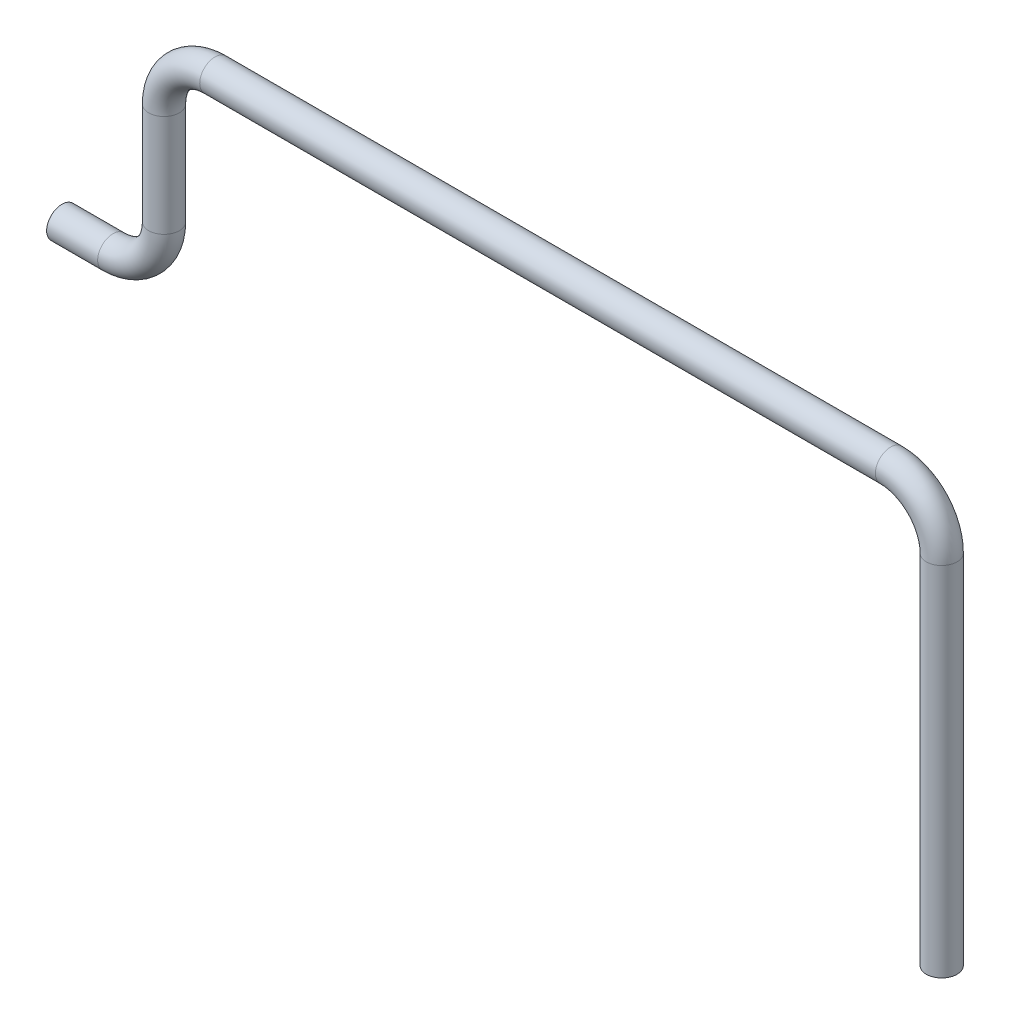
ISO-10303-21;
HEADER;
FILE_DESCRIPTION(('STEP AP214'),'2;1');
FILE_NAME('part.step','',(''),(''),'','','');
FILE_SCHEMA(('AUTOMOTIVE_DESIGN { 1 0 10303 214 1 1 1 1 }'));
ENDSEC;
DATA;
#1=APPLICATION_CONTEXT('core data for automotive mechanical design processes');
#2=APPLICATION_PROTOCOL_DEFINITION('international standard','automotive_design',2000,#1);
#3=PRODUCT_CONTEXT('',#1,'mechanical');
#4=PRODUCT('Part','Part','',(#3));
#5=PRODUCT_RELATED_PRODUCT_CATEGORY('part','',(#4));
#6=PRODUCT_DEFINITION_FORMATION('','',#4);
#7=PRODUCT_DEFINITION_CONTEXT('part definition',#1,'design');
#8=PRODUCT_DEFINITION('design','',#6,#7);
#9=PRODUCT_DEFINITION_SHAPE('','',#8);
#10=(LENGTH_UNIT() NAMED_UNIT(*) SI_UNIT(.MILLI.,.METRE.));
#11=(NAMED_UNIT(*) PLANE_ANGLE_UNIT() SI_UNIT($,.RADIAN.));
#12=(NAMED_UNIT(*) SI_UNIT($,.STERADIAN.) SOLID_ANGLE_UNIT());
#13=UNCERTAINTY_MEASURE_WITH_UNIT(LENGTH_MEASURE(1.E-05),#10,'distance_accuracy_value','');
#14=(GEOMETRIC_REPRESENTATION_CONTEXT(3) GLOBAL_UNCERTAINTY_ASSIGNED_CONTEXT((#13)) GLOBAL_UNIT_ASSIGNED_CONTEXT((#10,
#11,#12)) REPRESENTATION_CONTEXT('',''));
#15=CARTESIAN_POINT('',(0.,0.,0.));
#16=DIRECTION('',(0.,0.,1.));
#17=DIRECTION('',(1.,0.,0.));
#18=AXIS2_PLACEMENT_3D('',#15,#16,#17);
#19=CARTESIAN_POINT('',(0.,0.,0.));
#20=DIRECTION('',(-1.,0.,0.));
#21=DIRECTION('',(0.,0.,1.));
#22=AXIS2_PLACEMENT_3D('',#19,#20,#21);
#23=PLANE('',#22);
#24=CARTESIAN_POINT('',(0.,0.,0.));
#25=DIRECTION('',(-1.,0.,0.));
#26=DIRECTION('',(0.,0.,1.));
#27=AXIS2_PLACEMENT_3D('',#24,#25,#26);
#28=CIRCLE('',#27,1.5);
#29=CARTESIAN_POINT('',(0.,0.,1.5));
#30=VERTEX_POINT('',#29);
#31=EDGE_CURVE('E90',#30,#30,#28,.T.);
#32=ORIENTED_EDGE('',*,*,#31,.T.);
#33=EDGE_LOOP('',(#32));
#34=FACE_BOUND('',#33,.T.);
#35=ADVANCED_FACE('F55',(#34),#23,.T.);
#36=CARTESIAN_POINT('',(86.2,-20.,0.));
#37=DIRECTION('',(0.,1.,0.));
#38=DIRECTION('',(0.,0.,1.));
#39=AXIS2_PLACEMENT_3D('',#36,#37,#38);
#40=PLANE('',#39);
#41=CARTESIAN_POINT('',(86.2,-20.,0.));
#42=DIRECTION('',(0.,1.,0.));
#43=DIRECTION('',(0.,0.,1.));
#44=AXIS2_PLACEMENT_3D('',#41,#42,#43);
#45=CIRCLE('',#44,1.5);
#46=CARTESIAN_POINT('',(86.2,-20.,1.5));
#47=VERTEX_POINT('',#46);
#48=EDGE_CURVE('E11',#47,#47,#45,.T.);
#49=ORIENTED_EDGE('',*,*,#48,.F.);
#50=EDGE_LOOP('',(#49));
#51=FACE_BOUND('',#50,.T.);
#52=ADVANCED_FACE('F99',(#51),#40,.F.);
#53=CARTESIAN_POINT('',(0.,0.,0.));
#54=DIRECTION('',(1.,0.,0.));
#55=DIRECTION('',(0.,0.,-1.));
#56=AXIS2_PLACEMENT_3D('',#53,#54,#55);
#57=CYLINDRICAL_SURFACE('',#56,1.5);
#58=CARTESIAN_POINT('',(4.99999999999999,0.,0.));
#59=DIRECTION('',(-1.,0.,0.));
#60=DIRECTION('',(0.,0.,1.));
#61=AXIS2_PLACEMENT_3D('',#58,#59,#60);
#62=CIRCLE('',#61,1.5);
#63=CARTESIAN_POINT('',(4.99999999999999,-1.5,0.));
#64=VERTEX_POINT('',#63);
#65=EDGE_CURVE('E86',#64,#64,#62,.T.);
#66=ORIENTED_EDGE('',*,*,#65,.T.);
#67=EDGE_LOOP('',(#66));
#68=FACE_BOUND('',#67,.T.);
#69=ORIENTED_EDGE('',*,*,#31,.F.);
#70=EDGE_LOOP('',(#69));
#71=FACE_BOUND('',#70,.T.);
#72=ADVANCED_FACE('F96',(#68,#71),#57,.T.);
#73=CARTESIAN_POINT('',(4.99999999999999,5.,0.));
#74=DIRECTION('',(0.,0.,1.));
#75=DIRECTION('',(1.,0.,0.));
#76=AXIS2_PLACEMENT_3D('',#73,#74,#75);
#77=TOROIDAL_SURFACE('',#76,5.,1.5);
#78=CARTESIAN_POINT('',(9.99999999999999,5.,0.));
#79=DIRECTION('',(0.,-1.,0.));
#80=DIRECTION('',(0.,0.,1.));
#81=AXIS2_PLACEMENT_3D('',#78,#79,#80);
#82=CIRCLE('',#81,1.5);
#83=CARTESIAN_POINT('',(11.5,5.,0.));
#84=VERTEX_POINT('',#83);
#85=EDGE_CURVE('E82',#84,#84,#82,.T.);
#86=CARTESIAN_POINT('',(4.99999999999999,5.,0.));
#87=DIRECTION('',(0.,0.,1.));
#88=DIRECTION('',(1.,0.,0.));
#89=AXIS2_PLACEMENT_3D('',#86,#87,#88);
#90=CIRCLE('',#89,6.5);
#91=EDGE_CURVE('',#64,#84,#90,.T.);
#92=ORIENTED_EDGE('',*,*,#65,.F.);
#93=ORIENTED_EDGE('',*,*,#85,.T.);
#94=ORIENTED_EDGE('',*,*,#91,.T.);
#95=ORIENTED_EDGE('',*,*,#91,.F.);
#96=EDGE_LOOP('',(#92,#94,#93,#95));
#97=FACE_BOUND('',#96,.T.);
#98=ADVANCED_FACE('F98',(#97),#77,.T.);
#99=CARTESIAN_POINT('',(9.99999999999999,5.,0.));
#100=DIRECTION('',(0.,1.,0.));
#101=DIRECTION('',(0.,0.,1.));
#102=AXIS2_PLACEMENT_3D('',#99,#100,#101);
#103=CYLINDRICAL_SURFACE('',#102,1.5);
#104=CARTESIAN_POINT('',(9.99999999999999,15.,0.));
#105=DIRECTION('',(0.,-1.,0.));
#106=DIRECTION('',(0.,0.,1.));
#107=AXIS2_PLACEMENT_3D('',#104,#105,#106);
#108=CIRCLE('',#107,1.5);
#109=CARTESIAN_POINT('',(8.49999999999999,15.,0.));
#110=VERTEX_POINT('',#109);
#111=EDGE_CURVE('E78',#110,#110,#108,.T.);
#112=ORIENTED_EDGE('',*,*,#111,.T.);
#113=EDGE_LOOP('',(#112));
#114=FACE_BOUND('',#113,.T.);
#115=ORIENTED_EDGE('',*,*,#85,.F.);
#116=EDGE_LOOP('',(#115));
#117=FACE_BOUND('',#116,.T.);
#118=ADVANCED_FACE('F106',(#114,#117),#103,.T.);
#119=CARTESIAN_POINT('',(15.,15.,0.));
#120=DIRECTION('',(0.,0.,-1.));
#121=DIRECTION('',(-1.,0.,0.));
#122=AXIS2_PLACEMENT_3D('',#119,#120,#121);
#123=TOROIDAL_SURFACE('',#122,4.99999999999999,1.5);
#124=CARTESIAN_POINT('',(15.,20.,0.));
#125=DIRECTION('',(-1.,0.,0.));
#126=DIRECTION('',(0.,0.,1.));
#127=AXIS2_PLACEMENT_3D('',#124,#125,#126);
#128=CIRCLE('',#127,1.5);
#129=CARTESIAN_POINT('',(15.,21.5,0.));
#130=VERTEX_POINT('',#129);
#131=EDGE_CURVE('E72',#130,#130,#128,.T.);
#132=CARTESIAN_POINT('',(15.,15.,0.));
#133=DIRECTION('',(0.,0.,-1.));
#134=DIRECTION('',(-1.,0.,0.));
#135=AXIS2_PLACEMENT_3D('',#132,#133,#134);
#136=CIRCLE('',#135,6.49999999999999);
#137=EDGE_CURVE('',#110,#130,#136,.T.);
#138=ORIENTED_EDGE('',*,*,#111,.F.);
#139=ORIENTED_EDGE('',*,*,#131,.T.);
#140=ORIENTED_EDGE('',*,*,#137,.T.);
#141=ORIENTED_EDGE('',*,*,#137,.F.);
#142=EDGE_LOOP('',(#138,#140,#139,#141));
#143=FACE_BOUND('',#142,.T.);
#144=ADVANCED_FACE('F123',(#143),#123,.T.);
#145=CARTESIAN_POINT('',(15.,20.,0.));
#146=DIRECTION('',(1.,0.,0.));
#147=DIRECTION('',(0.,1.,0.));
#148=AXIS2_PLACEMENT_3D('',#145,#146,#147);
#149=CYLINDRICAL_SURFACE('',#148,1.5);
#150=CARTESIAN_POINT('',(81.2,20.,0.));
#151=DIRECTION('',(-1.,0.,0.));
#152=DIRECTION('',(0.,0.,1.));
#153=AXIS2_PLACEMENT_3D('',#150,#151,#152);
#154=CIRCLE('',#153,1.5);
#155=CARTESIAN_POINT('',(81.2,21.5,0.));
#156=VERTEX_POINT('',#155);
#157=EDGE_CURVE('E67',#156,#156,#154,.T.);
#158=ORIENTED_EDGE('',*,*,#157,.T.);
#159=EDGE_LOOP('',(#158));
#160=FACE_BOUND('',#159,.T.);
#161=ORIENTED_EDGE('',*,*,#131,.F.);
#162=EDGE_LOOP('',(#161));
#163=FACE_BOUND('',#162,.T.);
#164=ADVANCED_FACE('F117',(#160,#163),#149,.T.);
#165=CARTESIAN_POINT('',(81.2,15.,0.));
#166=DIRECTION('',(0.,0.,-1.));
#167=DIRECTION('',(-1.,0.,0.));
#168=AXIS2_PLACEMENT_3D('',#165,#166,#167);
#169=TOROIDAL_SURFACE('',#168,5.00000000000001,1.5);
#170=CARTESIAN_POINT('',(86.2,15.,0.));
#171=DIRECTION('',(0.,1.,0.));
#172=DIRECTION('',(0.,0.,1.));
#173=AXIS2_PLACEMENT_3D('',#170,#171,#172);
#174=CIRCLE('',#173,1.5);
#175=CARTESIAN_POINT('',(87.7,15.,0.));
#176=VERTEX_POINT('',#175);
#177=EDGE_CURVE('E62',#176,#176,#174,.T.);
#178=CARTESIAN_POINT('',(81.2,15.,0.));
#179=DIRECTION('',(0.,0.,-1.));
#180=DIRECTION('',(-1.,0.,0.));
#181=AXIS2_PLACEMENT_3D('',#178,#179,#180);
#182=CIRCLE('',#181,6.50000000000001);
#183=EDGE_CURVE('',#156,#176,#182,.T.);
#184=ORIENTED_EDGE('',*,*,#157,.F.);
#185=ORIENTED_EDGE('',*,*,#177,.T.);
#186=ORIENTED_EDGE('',*,*,#183,.T.);
#187=ORIENTED_EDGE('',*,*,#183,.F.);
#188=EDGE_LOOP('',(#184,#186,#185,#187));
#189=FACE_BOUND('',#188,.T.);
#190=ADVANCED_FACE('F112',(#189),#169,.T.);
#191=CARTESIAN_POINT('',(86.2,15.,0.));
#192=DIRECTION('',(0.,-1.,0.));
#193=DIRECTION('',(0.,0.,-1.));
#194=AXIS2_PLACEMENT_3D('',#191,#192,#193);
#195=CYLINDRICAL_SURFACE('',#194,1.5);
#196=ORIENTED_EDGE('',*,*,#48,.T.);
#197=EDGE_LOOP('',(#196));
#198=FACE_BOUND('',#197,.T.);
#199=ORIENTED_EDGE('',*,*,#177,.F.);
#200=EDGE_LOOP('',(#199));
#201=FACE_BOUND('',#200,.T.);
#202=ADVANCED_FACE('F110',(#198,#201),#195,.T.);
#203=CLOSED_SHELL('',(#35,#52,#72,#98,#118,#144,#164,#190,#202));
#204=MANIFOLD_SOLID_BREP('B2',#203);
#205=ADVANCED_BREP_SHAPE_REPRESENTATION('',(#18,#204),#14);
#206=SHAPE_DEFINITION_REPRESENTATION(#9,#205);
ENDSEC;
END-ISO-10303-21;
